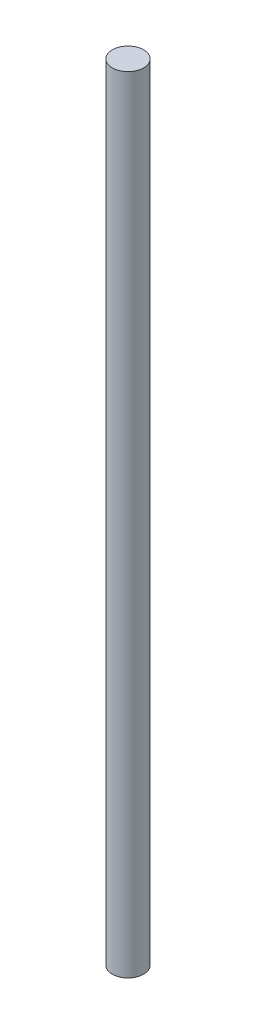
ISO-10303-21;
HEADER;
FILE_DESCRIPTION(('STEP AP214'),'2;1');
FILE_NAME('part.step','',(''),(''),'','','');
FILE_SCHEMA(('AUTOMOTIVE_DESIGN { 1 0 10303 214 1 1 1 1 }'));
ENDSEC;
DATA;
#1=APPLICATION_CONTEXT('core data for automotive mechanical design processes');
#2=APPLICATION_PROTOCOL_DEFINITION('international standard','automotive_design',2000,#1);
#3=PRODUCT_CONTEXT('',#1,'mechanical');
#4=PRODUCT('Part','Part','',(#3));
#5=PRODUCT_RELATED_PRODUCT_CATEGORY('part','',(#4));
#6=PRODUCT_DEFINITION_FORMATION('','',#4);
#7=PRODUCT_DEFINITION_CONTEXT('part definition',#1,'design');
#8=PRODUCT_DEFINITION('design','',#6,#7);
#9=PRODUCT_DEFINITION_SHAPE('','',#8);
#10=(LENGTH_UNIT() NAMED_UNIT(*) SI_UNIT(.MILLI.,.METRE.));
#11=(NAMED_UNIT(*) PLANE_ANGLE_UNIT() SI_UNIT($,.RADIAN.));
#12=(NAMED_UNIT(*) SI_UNIT($,.STERADIAN.) SOLID_ANGLE_UNIT());
#13=UNCERTAINTY_MEASURE_WITH_UNIT(LENGTH_MEASURE(1.E-05),#10,'distance_accuracy_value','');
#14=(GEOMETRIC_REPRESENTATION_CONTEXT(3) GLOBAL_UNCERTAINTY_ASSIGNED_CONTEXT((#13)) GLOBAL_UNIT_ASSIGNED_CONTEXT((#10,
#11,#12)) REPRESENTATION_CONTEXT('',''));
#15=CARTESIAN_POINT('',(0.,0.,0.));
#16=DIRECTION('',(0.,0.,1.));
#17=DIRECTION('',(1.,0.,0.));
#18=AXIS2_PLACEMENT_3D('',#15,#16,#17);
#19=CARTESIAN_POINT('',(0.,150.,0.));
#20=DIRECTION('',(0.,-1.,0.));
#21=DIRECTION('',(0.,0.,-1.));
#22=AXIS2_PLACEMENT_3D('',#19,#20,#21);
#23=CYLINDRICAL_SURFACE('',#22,6.);
#24=CARTESIAN_POINT('',(0.,150.,0.));
#25=DIRECTION('',(0.,1.,0.));
#26=DIRECTION('',(0.,0.,1.));
#27=AXIS2_PLACEMENT_3D('',#24,#25,#26);
#28=CIRCLE('',#27,6.);
#29=CARTESIAN_POINT('',(0.,150.,6.));
#30=VERTEX_POINT('',#29);
#31=EDGE_CURVE('E10',#30,#30,#28,.T.);
#32=ORIENTED_EDGE('',*,*,#31,.F.);
#33=EDGE_LOOP('',(#32));
#34=FACE_BOUND('',#33,.T.);
#35=CARTESIAN_POINT('',(0.,-150.,0.));
#36=DIRECTION('',(0.,1.,0.));
#37=DIRECTION('',(0.,0.,1.));
#38=AXIS2_PLACEMENT_3D('',#35,#36,#37);
#39=CIRCLE('',#38,6.);
#40=CARTESIAN_POINT('',(0.,-150.,6.));
#41=VERTEX_POINT('',#40);
#42=EDGE_CURVE('E33',#41,#41,#39,.T.);
#43=ORIENTED_EDGE('',*,*,#42,.T.);
#44=EDGE_LOOP('',(#43));
#45=FACE_BOUND('',#44,.T.);
#46=ADVANCED_FACE('F30',(#34,#45),#23,.T.);
#47=CARTESIAN_POINT('',(0.,150.,0.));
#48=DIRECTION('',(0.,1.,0.));
#49=DIRECTION('',(0.,0.,1.));
#50=AXIS2_PLACEMENT_3D('',#47,#48,#49);
#51=PLANE('',#50);
#52=ORIENTED_EDGE('',*,*,#31,.T.);
#53=EDGE_LOOP('',(#52));
#54=FACE_BOUND('',#53,.T.);
#55=ADVANCED_FACE('F45',(#54),#51,.T.);
#56=CARTESIAN_POINT('',(0.,-150.,0.));
#57=DIRECTION('',(0.,1.,0.));
#58=DIRECTION('',(0.,0.,1.));
#59=AXIS2_PLACEMENT_3D('',#56,#57,#58);
#60=PLANE('',#59);
#61=ORIENTED_EDGE('',*,*,#42,.F.);
#62=EDGE_LOOP('',(#61));
#63=FACE_BOUND('',#62,.T.);
#64=ADVANCED_FACE('F43',(#63),#60,.F.);
#65=CLOSED_SHELL('',(#46,#55,#64));
#66=MANIFOLD_SOLID_BREP('B2',#65);
#67=ADVANCED_BREP_SHAPE_REPRESENTATION('',(#18,#66),#14);
#68=SHAPE_DEFINITION_REPRESENTATION(#9,#67);
ENDSEC;
END-ISO-10303-21;
